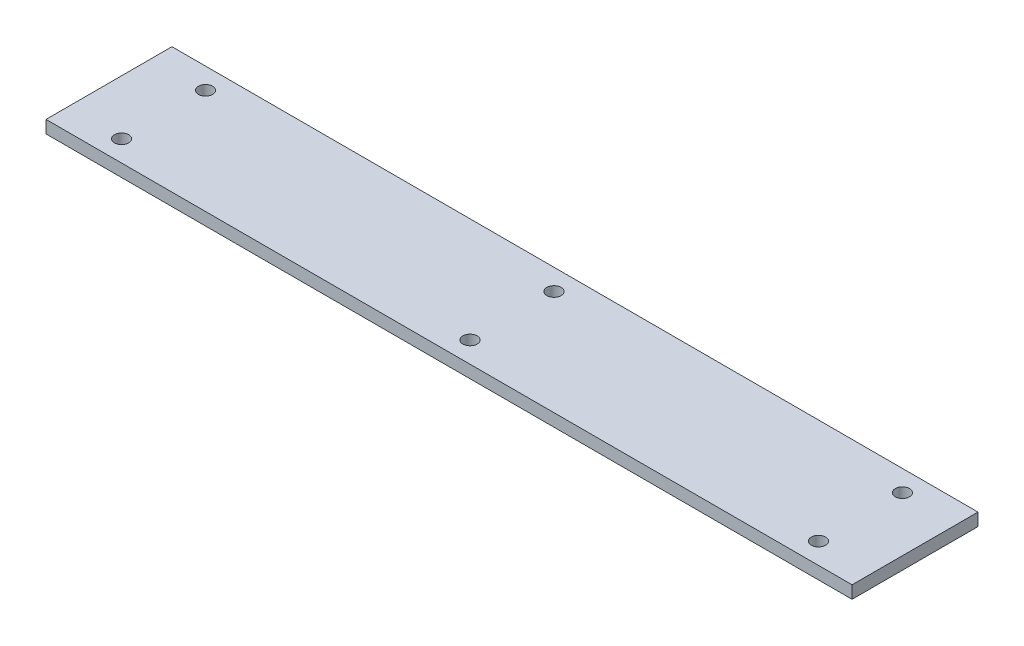
ISO-10303-21;
HEADER;
FILE_DESCRIPTION(('STEP AP214'),'2;1');
FILE_NAME('part.step','',(''),(''),'','','');
FILE_SCHEMA(('AUTOMOTIVE_DESIGN { 1 0 10303 214 1 1 1 1 }'));
ENDSEC;
DATA;
#1=APPLICATION_CONTEXT('core data for automotive mechanical design processes');
#2=APPLICATION_PROTOCOL_DEFINITION('international standard','automotive_design',2000,#1);
#3=PRODUCT_CONTEXT('',#1,'mechanical');
#4=PRODUCT('Part','Part','',(#3));
#5=PRODUCT_RELATED_PRODUCT_CATEGORY('part','',(#4));
#6=PRODUCT_DEFINITION_FORMATION('','',#4);
#7=PRODUCT_DEFINITION_CONTEXT('part definition',#1,'design');
#8=PRODUCT_DEFINITION('design','',#6,#7);
#9=PRODUCT_DEFINITION_SHAPE('','',#8);
#10=(LENGTH_UNIT() NAMED_UNIT(*) SI_UNIT(.MILLI.,.METRE.));
#11=(NAMED_UNIT(*) PLANE_ANGLE_UNIT() SI_UNIT($,.RADIAN.));
#12=(NAMED_UNIT(*) SI_UNIT($,.STERADIAN.) SOLID_ANGLE_UNIT());
#13=UNCERTAINTY_MEASURE_WITH_UNIT(LENGTH_MEASURE(1.E-05),#10,'distance_accuracy_value','');
#14=(GEOMETRIC_REPRESENTATION_CONTEXT(3) GLOBAL_UNCERTAINTY_ASSIGNED_CONTEXT((#13)) GLOBAL_UNIT_ASSIGNED_CONTEXT((#10,
#11,#12)) REPRESENTATION_CONTEXT('',''));
#15=CARTESIAN_POINT('',(0.,0.,0.));
#16=DIRECTION('',(0.,0.,1.));
#17=DIRECTION('',(1.,0.,0.));
#18=AXIS2_PLACEMENT_3D('',#15,#16,#17);
#19=CARTESIAN_POINT('',(0.,3.,0.));
#20=DIRECTION('',(0.,-1.,0.));
#21=DIRECTION('',(0.,0.,-1.));
#22=AXIS2_PLACEMENT_3D('',#19,#20,#21);
#23=PLANE('',#22);
#24=DIRECTION('',(0.,0.,1.));
#25=VECTOR('',#24,1.);
#26=CARTESIAN_POINT('',(0.,3.,0.));
#27=LINE('',#26,#25);
#28=CARTESIAN_POINT('',(0.,3.,-30.));
#29=VERTEX_POINT('',#28);
#30=CARTESIAN_POINT('',(0.,3.,0.));
#31=VERTEX_POINT('',#30);
#32=EDGE_CURVE('E96',#29,#31,#27,.T.);
#33=ORIENTED_EDGE('',*,*,#32,.T.);
#34=DIRECTION('',(1.,0.,0.));
#35=VECTOR('',#34,1.);
#36=CARTESIAN_POINT('',(0.,3.,0.));
#37=LINE('',#36,#35);
#38=CARTESIAN_POINT('',(192.,3.,0.));
#39=VERTEX_POINT('',#38);
#40=EDGE_CURVE('E91',#31,#39,#37,.T.);
#41=ORIENTED_EDGE('',*,*,#40,.T.);
#42=DIRECTION('',(0.,0.,-1.));
#43=VECTOR('',#42,1.);
#44=CARTESIAN_POINT('',(192.,3.,0.));
#45=LINE('',#44,#43);
#46=CARTESIAN_POINT('',(192.,3.,-30.));
#47=VERTEX_POINT('',#46);
#48=EDGE_CURVE('E94',#39,#47,#45,.T.);
#49=ORIENTED_EDGE('',*,*,#48,.T.);
#50=DIRECTION('',(-1.,0.,0.));
#51=VECTOR('',#50,1.);
#52=CARTESIAN_POINT('',(0.,3.,-30.));
#53=LINE('',#52,#51);
#54=EDGE_CURVE('E61',#47,#29,#53,.T.);
#55=ORIENTED_EDGE('',*,*,#54,.T.);
#56=EDGE_LOOP('',(#33,#41,#49,#55));
#57=FACE_BOUND('',#56,.T.);
#58=CARTESIAN_POINT('',(13.,3.,-25.));
#59=DIRECTION('',(0.,1.,0.));
#60=DIRECTION('',(0.,0.,1.));
#61=AXIS2_PLACEMENT_3D('',#58,#59,#60);
#62=CIRCLE('',#61,1.7);
#63=CARTESIAN_POINT('',(13.,3.,-23.3));
#64=VERTEX_POINT('',#63);
#65=EDGE_CURVE('E116',#64,#64,#62,.T.);
#66=ORIENTED_EDGE('',*,*,#65,.F.);
#67=EDGE_LOOP('',(#66));
#68=FACE_BOUND('',#67,.T.);
#69=CARTESIAN_POINT('',(13.,3.,-5.));
#70=DIRECTION('',(0.,1.,0.));
#71=DIRECTION('',(0.,0.,1.));
#72=AXIS2_PLACEMENT_3D('',#69,#70,#71);
#73=CIRCLE('',#72,1.7);
#74=CARTESIAN_POINT('',(13.,3.,-3.3));
#75=VERTEX_POINT('',#74);
#76=EDGE_CURVE('E138',#75,#75,#73,.T.);
#77=ORIENTED_EDGE('',*,*,#76,.F.);
#78=EDGE_LOOP('',(#77));
#79=FACE_BOUND('',#78,.T.);
#80=CARTESIAN_POINT('',(96.,3.,-25.));
#81=DIRECTION('',(0.,1.,0.));
#82=DIRECTION('',(0.,0.,1.));
#83=AXIS2_PLACEMENT_3D('',#80,#81,#82);
#84=CIRCLE('',#83,1.7);
#85=CARTESIAN_POINT('',(96.,3.,-23.3));
#86=VERTEX_POINT('',#85);
#87=EDGE_CURVE('E146',#86,#86,#84,.T.);
#88=ORIENTED_EDGE('',*,*,#87,.F.);
#89=EDGE_LOOP('',(#88));
#90=FACE_BOUND('',#89,.T.);
#91=CARTESIAN_POINT('',(96.,3.,-5.));
#92=DIRECTION('',(0.,1.,0.));
#93=DIRECTION('',(0.,0.,1.));
#94=AXIS2_PLACEMENT_3D('',#91,#92,#93);
#95=CIRCLE('',#94,1.7);
#96=CARTESIAN_POINT('',(96.,3.,-3.3));
#97=VERTEX_POINT('',#96);
#98=EDGE_CURVE('E154',#97,#97,#95,.T.);
#99=ORIENTED_EDGE('',*,*,#98,.F.);
#100=EDGE_LOOP('',(#99));
#101=FACE_BOUND('',#100,.T.);
#102=CARTESIAN_POINT('',(179.,3.,-25.));
#103=DIRECTION('',(0.,1.,0.));
#104=DIRECTION('',(0.,0.,1.));
#105=AXIS2_PLACEMENT_3D('',#102,#103,#104);
#106=CIRCLE('',#105,1.70000000000001);
#107=CARTESIAN_POINT('',(179.,3.,-23.3));
#108=VERTEX_POINT('',#107);
#109=EDGE_CURVE('E162',#108,#108,#106,.T.);
#110=ORIENTED_EDGE('',*,*,#109,.F.);
#111=EDGE_LOOP('',(#110));
#112=FACE_BOUND('',#111,.T.);
#113=CARTESIAN_POINT('',(179.,3.,-5.));
#114=DIRECTION('',(0.,1.,0.));
#115=DIRECTION('',(0.,0.,1.));
#116=AXIS2_PLACEMENT_3D('',#113,#114,#115);
#117=CIRCLE('',#116,1.70000000000001);
#118=CARTESIAN_POINT('',(179.,3.,-3.29999999999998));
#119=VERTEX_POINT('',#118);
#120=EDGE_CURVE('E170',#119,#119,#117,.T.);
#121=ORIENTED_EDGE('',*,*,#120,.F.);
#122=EDGE_LOOP('',(#121));
#123=FACE_BOUND('',#122,.T.);
#124=ADVANCED_FACE('F43',(#57,#68,#79,#90,#101,#112,#123),#23,.F.);
#125=CARTESIAN_POINT('',(0.,0.,0.));
#126=DIRECTION('',(0.,-1.,0.));
#127=DIRECTION('',(0.,0.,-1.));
#128=AXIS2_PLACEMENT_3D('',#125,#126,#127);
#129=PLANE('',#128);
#130=CARTESIAN_POINT('',(179.,0.,-25.));
#131=DIRECTION('',(0.,1.,0.));
#132=DIRECTION('',(0.,0.,1.));
#133=AXIS2_PLACEMENT_3D('',#130,#131,#132);
#134=CIRCLE('',#133,1.70000000000001);
#135=CARTESIAN_POINT('',(179.,0.,-23.3));
#136=VERTEX_POINT('',#135);
#137=EDGE_CURVE('E166',#136,#136,#134,.T.);
#138=ORIENTED_EDGE('',*,*,#137,.T.);
#139=EDGE_LOOP('',(#138));
#140=FACE_BOUND('',#139,.T.);
#141=CARTESIAN_POINT('',(96.,0.,-25.));
#142=DIRECTION('',(0.,1.,0.));
#143=DIRECTION('',(0.,0.,1.));
#144=AXIS2_PLACEMENT_3D('',#141,#142,#143);
#145=CIRCLE('',#144,1.7);
#146=CARTESIAN_POINT('',(96.,0.,-23.3));
#147=VERTEX_POINT('',#146);
#148=EDGE_CURVE('E150',#147,#147,#145,.T.);
#149=ORIENTED_EDGE('',*,*,#148,.T.);
#150=EDGE_LOOP('',(#149));
#151=FACE_BOUND('',#150,.T.);
#152=CARTESIAN_POINT('',(13.,0.,-25.));
#153=DIRECTION('',(0.,1.,0.));
#154=DIRECTION('',(0.,0.,1.));
#155=AXIS2_PLACEMENT_3D('',#152,#153,#154);
#156=CIRCLE('',#155,1.7);
#157=CARTESIAN_POINT('',(13.,0.,-23.3));
#158=VERTEX_POINT('',#157);
#159=EDGE_CURVE('E134',#158,#158,#156,.T.);
#160=ORIENTED_EDGE('',*,*,#159,.T.);
#161=EDGE_LOOP('',(#160));
#162=FACE_BOUND('',#161,.T.);
#163=DIRECTION('',(0.,0.,1.));
#164=VECTOR('',#163,1.);
#165=CARTESIAN_POINT('',(0.,0.,0.));
#166=LINE('',#165,#164);
#167=CARTESIAN_POINT('',(0.,0.,-30.));
#168=VERTEX_POINT('',#167);
#169=CARTESIAN_POINT('',(0.,0.,0.));
#170=VERTEX_POINT('',#169);
#171=EDGE_CURVE('E112',#168,#170,#166,.T.);
#172=ORIENTED_EDGE('',*,*,#171,.F.);
#173=DIRECTION('',(-1.,0.,0.));
#174=VECTOR('',#173,1.);
#175=CARTESIAN_POINT('',(0.,0.,-30.));
#176=LINE('',#175,#174);
#177=CARTESIAN_POINT('',(192.,0.,-30.));
#178=VERTEX_POINT('',#177);
#179=EDGE_CURVE('E84',#178,#168,#176,.T.);
#180=ORIENTED_EDGE('',*,*,#179,.F.);
#181=DIRECTION('',(0.,0.,-1.));
#182=VECTOR('',#181,1.);
#183=CARTESIAN_POINT('',(192.,0.,0.));
#184=LINE('',#183,#182);
#185=CARTESIAN_POINT('',(192.,0.,0.));
#186=VERTEX_POINT('',#185);
#187=EDGE_CURVE('E78',#186,#178,#184,.T.);
#188=ORIENTED_EDGE('',*,*,#187,.F.);
#189=DIRECTION('',(1.,0.,0.));
#190=VECTOR('',#189,1.);
#191=CARTESIAN_POINT('',(0.,0.,0.));
#192=LINE('',#191,#190);
#193=EDGE_CURVE('E101',#170,#186,#192,.T.);
#194=ORIENTED_EDGE('',*,*,#193,.F.);
#195=EDGE_LOOP('',(#172,#180,#188,#194));
#196=FACE_BOUND('',#195,.T.);
#197=CARTESIAN_POINT('',(13.,0.,-5.));
#198=DIRECTION('',(0.,1.,0.));
#199=DIRECTION('',(0.,0.,1.));
#200=AXIS2_PLACEMENT_3D('',#197,#198,#199);
#201=CIRCLE('',#200,1.7);
#202=CARTESIAN_POINT('',(13.,0.,-3.3));
#203=VERTEX_POINT('',#202);
#204=EDGE_CURVE('E142',#203,#203,#201,.T.);
#205=ORIENTED_EDGE('',*,*,#204,.T.);
#206=EDGE_LOOP('',(#205));
#207=FACE_BOUND('',#206,.T.);
#208=CARTESIAN_POINT('',(96.,0.,-5.));
#209=DIRECTION('',(0.,1.,0.));
#210=DIRECTION('',(0.,0.,1.));
#211=AXIS2_PLACEMENT_3D('',#208,#209,#210);
#212=CIRCLE('',#211,1.7);
#213=CARTESIAN_POINT('',(96.,0.,-3.3));
#214=VERTEX_POINT('',#213);
#215=EDGE_CURVE('E158',#214,#214,#212,.T.);
#216=ORIENTED_EDGE('',*,*,#215,.T.);
#217=EDGE_LOOP('',(#216));
#218=FACE_BOUND('',#217,.T.);
#219=CARTESIAN_POINT('',(179.,0.,-5.));
#220=DIRECTION('',(0.,1.,0.));
#221=DIRECTION('',(0.,0.,1.));
#222=AXIS2_PLACEMENT_3D('',#219,#220,#221);
#223=CIRCLE('',#222,1.70000000000001);
#224=CARTESIAN_POINT('',(179.,0.,-3.29999999999998));
#225=VERTEX_POINT('',#224);
#226=EDGE_CURVE('E174',#225,#225,#223,.T.);
#227=ORIENTED_EDGE('',*,*,#226,.T.);
#228=EDGE_LOOP('',(#227));
#229=FACE_BOUND('',#228,.T.);
#230=ADVANCED_FACE('F129',(#140,#151,#162,#196,#207,#218,#229),#129,.T.);
#231=CARTESIAN_POINT('',(0.,3.,0.));
#232=DIRECTION('',(1.,0.,0.));
#233=DIRECTION('',(0.,0.,-1.));
#234=AXIS2_PLACEMENT_3D('',#231,#232,#233);
#235=PLANE('',#234);
#236=ORIENTED_EDGE('',*,*,#171,.T.);
#237=DIRECTION('',(0.,-1.,0.));
#238=VECTOR('',#237,1.);
#239=CARTESIAN_POINT('',(0.,3.,0.));
#240=LINE('',#239,#238);
#241=EDGE_CURVE('E11',#31,#170,#240,.T.);
#242=ORIENTED_EDGE('',*,*,#241,.F.);
#243=ORIENTED_EDGE('',*,*,#32,.F.);
#244=DIRECTION('',(0.,-1.,0.));
#245=VECTOR('',#244,1.);
#246=CARTESIAN_POINT('',(0.,3.,-30.));
#247=LINE('',#246,#245);
#248=EDGE_CURVE('E108',#29,#168,#247,.T.);
#249=ORIENTED_EDGE('',*,*,#248,.T.);
#250=EDGE_LOOP('',(#236,#242,#243,#249));
#251=FACE_BOUND('',#250,.T.);
#252=ADVANCED_FACE('F45',(#251),#235,.F.);
#253=CARTESIAN_POINT('',(0.,3.,0.));
#254=DIRECTION('',(0.,0.,-1.));
#255=DIRECTION('',(-1.,0.,0.));
#256=AXIS2_PLACEMENT_3D('',#253,#254,#255);
#257=PLANE('',#256);
#258=ORIENTED_EDGE('',*,*,#193,.T.);
#259=DIRECTION('',(0.,-1.,0.));
#260=VECTOR('',#259,1.);
#261=CARTESIAN_POINT('',(192.,3.,0.));
#262=LINE('',#261,#260);
#263=EDGE_CURVE('E53',#39,#186,#262,.T.);
#264=ORIENTED_EDGE('',*,*,#263,.F.);
#265=ORIENTED_EDGE('',*,*,#40,.F.);
#266=ORIENTED_EDGE('',*,*,#241,.T.);
#267=EDGE_LOOP('',(#258,#264,#265,#266));
#268=FACE_BOUND('',#267,.T.);
#269=ADVANCED_FACE('F100',(#268),#257,.F.);
#270=CARTESIAN_POINT('',(192.,3.,0.));
#271=DIRECTION('',(-1.,0.,0.));
#272=DIRECTION('',(0.,0.,1.));
#273=AXIS2_PLACEMENT_3D('',#270,#271,#272);
#274=PLANE('',#273);
#275=ORIENTED_EDGE('',*,*,#187,.T.);
#276=DIRECTION('',(0.,-1.,0.));
#277=VECTOR('',#276,1.);
#278=CARTESIAN_POINT('',(192.,3.,-30.));
#279=LINE('',#278,#277);
#280=EDGE_CURVE('E103',#47,#178,#279,.T.);
#281=ORIENTED_EDGE('',*,*,#280,.F.);
#282=ORIENTED_EDGE('',*,*,#48,.F.);
#283=ORIENTED_EDGE('',*,*,#263,.T.);
#284=EDGE_LOOP('',(#275,#281,#282,#283));
#285=FACE_BOUND('',#284,.T.);
#286=ADVANCED_FACE('F104',(#285),#274,.F.);
#287=CARTESIAN_POINT('',(0.,3.,-30.));
#288=DIRECTION('',(0.,0.,1.));
#289=DIRECTION('',(1.,0.,0.));
#290=AXIS2_PLACEMENT_3D('',#287,#288,#289);
#291=PLANE('',#290);
#292=ORIENTED_EDGE('',*,*,#179,.T.);
#293=ORIENTED_EDGE('',*,*,#248,.F.);
#294=ORIENTED_EDGE('',*,*,#54,.F.);
#295=ORIENTED_EDGE('',*,*,#280,.T.);
#296=EDGE_LOOP('',(#292,#293,#294,#295));
#297=FACE_BOUND('',#296,.T.);
#298=ADVANCED_FACE('F126',(#297),#291,.F.);
#299=CARTESIAN_POINT('',(13.,3.,-25.));
#300=DIRECTION('',(0.,-1.,0.));
#301=DIRECTION('',(0.,0.,-1.));
#302=AXIS2_PLACEMENT_3D('',#299,#300,#301);
#303=CYLINDRICAL_SURFACE('',#302,1.7);
#304=ORIENTED_EDGE('',*,*,#65,.T.);
#305=EDGE_LOOP('',(#304));
#306=FACE_BOUND('',#305,.T.);
#307=ORIENTED_EDGE('',*,*,#159,.F.);
#308=EDGE_LOOP('',(#307));
#309=FACE_BOUND('',#308,.T.);
#310=ADVANCED_FACE('F193',(#306,#309),#303,.F.);
#311=CARTESIAN_POINT('',(13.,3.,-5.));
#312=DIRECTION('',(0.,-1.,0.));
#313=DIRECTION('',(0.,0.,-1.));
#314=AXIS2_PLACEMENT_3D('',#311,#312,#313);
#315=CYLINDRICAL_SURFACE('',#314,1.7);
#316=ORIENTED_EDGE('',*,*,#76,.T.);
#317=EDGE_LOOP('',(#316));
#318=FACE_BOUND('',#317,.T.);
#319=ORIENTED_EDGE('',*,*,#204,.F.);
#320=EDGE_LOOP('',(#319));
#321=FACE_BOUND('',#320,.T.);
#322=ADVANCED_FACE('F247',(#318,#321),#315,.F.);
#323=CARTESIAN_POINT('',(96.,3.,-25.));
#324=DIRECTION('',(0.,-1.,0.));
#325=DIRECTION('',(0.,0.,-1.));
#326=AXIS2_PLACEMENT_3D('',#323,#324,#325);
#327=CYLINDRICAL_SURFACE('',#326,1.7);
#328=ORIENTED_EDGE('',*,*,#87,.T.);
#329=EDGE_LOOP('',(#328));
#330=FACE_BOUND('',#329,.T.);
#331=ORIENTED_EDGE('',*,*,#148,.F.);
#332=EDGE_LOOP('',(#331));
#333=FACE_BOUND('',#332,.T.);
#334=ADVANCED_FACE('F256',(#330,#333),#327,.F.);
#335=CARTESIAN_POINT('',(96.,3.,-5.));
#336=DIRECTION('',(0.,-1.,0.));
#337=DIRECTION('',(0.,0.,-1.));
#338=AXIS2_PLACEMENT_3D('',#335,#336,#337);
#339=CYLINDRICAL_SURFACE('',#338,1.7);
#340=ORIENTED_EDGE('',*,*,#98,.T.);
#341=EDGE_LOOP('',(#340));
#342=FACE_BOUND('',#341,.T.);
#343=ORIENTED_EDGE('',*,*,#215,.F.);
#344=EDGE_LOOP('',(#343));
#345=FACE_BOUND('',#344,.T.);
#346=ADVANCED_FACE('F265',(#342,#345),#339,.F.);
#347=CARTESIAN_POINT('',(179.,3.,-25.));
#348=DIRECTION('',(0.,-1.,0.));
#349=DIRECTION('',(0.,0.,-1.));
#350=AXIS2_PLACEMENT_3D('',#347,#348,#349);
#351=CYLINDRICAL_SURFACE('',#350,1.70000000000001);
#352=ORIENTED_EDGE('',*,*,#109,.T.);
#353=EDGE_LOOP('',(#352));
#354=FACE_BOUND('',#353,.T.);
#355=ORIENTED_EDGE('',*,*,#137,.F.);
#356=EDGE_LOOP('',(#355));
#357=FACE_BOUND('',#356,.T.);
#358=ADVANCED_FACE('F275',(#354,#357),#351,.F.);
#359=CARTESIAN_POINT('',(179.,3.,-5.));
#360=DIRECTION('',(0.,-1.,0.));
#361=DIRECTION('',(0.,0.,-1.));
#362=AXIS2_PLACEMENT_3D('',#359,#360,#361);
#363=CYLINDRICAL_SURFACE('',#362,1.70000000000001);
#364=ORIENTED_EDGE('',*,*,#120,.T.);
#365=EDGE_LOOP('',(#364));
#366=FACE_BOUND('',#365,.T.);
#367=ORIENTED_EDGE('',*,*,#226,.F.);
#368=EDGE_LOOP('',(#367));
#369=FACE_BOUND('',#368,.T.);
#370=ADVANCED_FACE('F182',(#366,#369),#363,.F.);
#371=CLOSED_SHELL('',(#124,#230,#252,#269,#286,#298,#310,#322,#334,#346,#358,#370));
#372=MANIFOLD_SOLID_BREP('B2',#371);
#373=ADVANCED_BREP_SHAPE_REPRESENTATION('',(#18,#372),#14);
#374=SHAPE_DEFINITION_REPRESENTATION(#9,#373);
ENDSEC;
END-ISO-10303-21;
